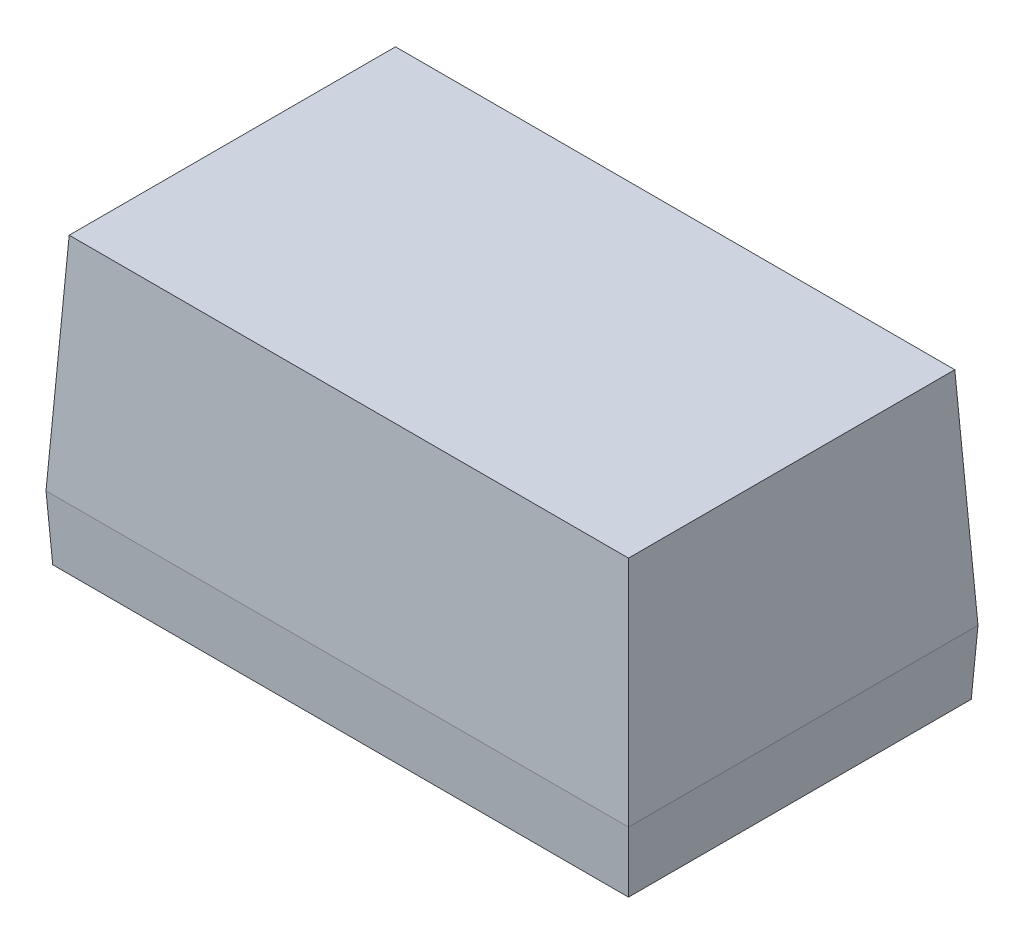
ISO-10303-21;
HEADER;
FILE_DESCRIPTION(('STEP AP214'),'2;1');
FILE_NAME('part.step','',(''),(''),'','','');
FILE_SCHEMA(('AUTOMOTIVE_DESIGN { 1 0 10303 214 1 1 1 1 }'));
ENDSEC;
DATA;
#1=APPLICATION_CONTEXT('core data for automotive mechanical design processes');
#2=APPLICATION_PROTOCOL_DEFINITION('international standard','automotive_design',2000,#1);
#3=PRODUCT_CONTEXT('',#1,'mechanical');
#4=PRODUCT('Part','Part','',(#3));
#5=PRODUCT_RELATED_PRODUCT_CATEGORY('part','',(#4));
#6=PRODUCT_DEFINITION_FORMATION('','',#4);
#7=PRODUCT_DEFINITION_CONTEXT('part definition',#1,'design');
#8=PRODUCT_DEFINITION('design','',#6,#7);
#9=PRODUCT_DEFINITION_SHAPE('','',#8);
#10=(LENGTH_UNIT() NAMED_UNIT(*) SI_UNIT(.MILLI.,.METRE.));
#11=(NAMED_UNIT(*) PLANE_ANGLE_UNIT() SI_UNIT($,.RADIAN.));
#12=(NAMED_UNIT(*) SI_UNIT($,.STERADIAN.) SOLID_ANGLE_UNIT());
#13=UNCERTAINTY_MEASURE_WITH_UNIT(LENGTH_MEASURE(1.E-05),#10,'distance_accuracy_value','');
#14=(GEOMETRIC_REPRESENTATION_CONTEXT(3) GLOBAL_UNCERTAINTY_ASSIGNED_CONTEXT((#13)) GLOBAL_UNIT_ASSIGNED_CONTEXT((#10,
#11,#12)) REPRESENTATION_CONTEXT('',''));
#15=CARTESIAN_POINT('',(0.,0.,0.));
#16=DIRECTION('',(0.,0.,1.));
#17=DIRECTION('',(1.,0.,0.));
#18=AXIS2_PLACEMENT_3D('',#15,#16,#17);
#19=CARTESIAN_POINT('',(4.0212,2.9756,2.8242));
#20=DIRECTION('',(0.,1.,0.));
#21=DIRECTION('',(0.,0.,1.));
#22=AXIS2_PLACEMENT_3D('',#19,#20,#21);
#23=PLANE('',#22);
#24=DIRECTION('',(1.,0.,0.));
#25=VECTOR('',#24,1.);
#26=CARTESIAN_POINT('',(4.0212,2.9756,3.4184351442789));
#27=LINE('',#26,#25);
#28=CARTESIAN_POINT('',(4.0269648557211,2.9756,3.4184351442789));
#29=VERTEX_POINT('',#28);
#30=CARTESIAN_POINT('',(5.0154351442789,2.9756,3.4184351442789));
#31=VERTEX_POINT('',#30);
#32=EDGE_CURVE('E11',#29,#31,#27,.T.);
#33=ORIENTED_EDGE('',*,*,#32,.F.);
#34=DIRECTION('',(0.,0.,1.));
#35=VECTOR('',#34,1.);
#36=CARTESIAN_POINT('',(4.0269648557211,2.9756,2.8242));
#37=LINE('',#36,#35);
#38=CARTESIAN_POINT('',(4.0269648557211,2.9756,2.8299648557211));
#39=VERTEX_POINT('',#38);
#40=EDGE_CURVE('E24',#39,#29,#37,.T.);
#41=ORIENTED_EDGE('',*,*,#40,.F.);
#42=DIRECTION('',(-1.,0.,0.));
#43=VECTOR('',#42,1.);
#44=CARTESIAN_POINT('',(4.0212,2.9756,2.8299648557211));
#45=LINE('',#44,#43);
#46=CARTESIAN_POINT('',(5.0154351442789,2.9756,2.8299648557211));
#47=VERTEX_POINT('',#46);
#48=EDGE_CURVE('E122',#47,#39,#45,.T.);
#49=ORIENTED_EDGE('',*,*,#48,.F.);
#50=DIRECTION('',(0.,0.,-1.));
#51=VECTOR('',#50,1.);
#52=CARTESIAN_POINT('',(5.0154351442789,2.9756,2.8242));
#53=LINE('',#52,#51);
#54=EDGE_CURVE('E119',#31,#47,#53,.T.);
#55=ORIENTED_EDGE('',*,*,#54,.F.);
#56=EDGE_LOOP('',(#33,#41,#49,#55));
#57=FACE_BOUND('',#56,.T.);
#58=ADVANCED_FACE('F17',(#57),#23,.F.);
#59=CARTESIAN_POINT('',(5.0212,3.0856,2.8242));
#60=DIRECTION('',(0.998629534754574,-0.0523359562429439,0.));
#61=DIRECTION('',(0.0523359562429439,0.998629534754574,0.));
#62=AXIS2_PLACEMENT_3D('',#59,#60,#61);
#63=PLANE('',#62);
#64=DIRECTION('',(0.,0.,1.));
#65=VECTOR('',#64,1.);
#66=CARTESIAN_POINT('',(5.0212,3.0856,2.8242));
#67=LINE('',#66,#65);
#68=CARTESIAN_POINT('',(5.0212,3.0856,2.8242));
#69=VERTEX_POINT('',#68);
#70=CARTESIAN_POINT('',(5.0212,3.0856,3.4242));
#71=VERTEX_POINT('',#70);
#72=EDGE_CURVE('E117',#69,#71,#67,.T.);
#73=ORIENTED_EDGE('',*,*,#72,.T.);
#74=DIRECTION('',(-0.0522644276887144,-0.997264688634237,-0.0522644276887144));
#75=VECTOR('',#74,1.);
#76=CARTESIAN_POINT('',(5.0212,3.0856,3.4242));
#77=LINE('',#76,#75);
#78=EDGE_CURVE('E114',#71,#31,#77,.T.);
#79=ORIENTED_EDGE('',*,*,#78,.T.);
#80=ORIENTED_EDGE('',*,*,#54,.T.);
#81=DIRECTION('',(0.0522644276887144,0.997264688634237,-0.0522644276887139));
#82=VECTOR('',#81,1.);
#83=CARTESIAN_POINT('',(5.0154351442789,2.9756,2.8299648557211));
#84=LINE('',#83,#82);
#85=EDGE_CURVE('E111',#47,#69,#84,.T.);
#86=ORIENTED_EDGE('',*,*,#85,.T.);
#87=EDGE_LOOP('',(#73,#79,#80,#86));
#88=FACE_BOUND('',#87,.T.);
#89=ADVANCED_FACE('F137',(#88),#63,.T.);
#90=CARTESIAN_POINT('',(5.0212,3.0856,3.4242));
#91=DIRECTION('',(0.,-0.052335956242944,0.998629534754574));
#92=DIRECTION('',(0.,-0.998629534754574,-0.052335956242944));
#93=AXIS2_PLACEMENT_3D('',#90,#91,#92);
#94=PLANE('',#93);
#95=DIRECTION('',(-1.,0.,0.));
#96=VECTOR('',#95,1.);
#97=CARTESIAN_POINT('',(5.0212,3.0856,3.4242));
#98=LINE('',#97,#96);
#99=CARTESIAN_POINT('',(4.0212,3.0856,3.4242));
#100=VERTEX_POINT('',#99);
#101=EDGE_CURVE('E109',#71,#100,#98,.T.);
#102=ORIENTED_EDGE('',*,*,#101,.T.);
#103=DIRECTION('',(0.0522644276887154,-0.997264688634237,-0.0522644276887139));
#104=VECTOR('',#103,1.);
#105=CARTESIAN_POINT('',(4.0212,3.0856,3.4242));
#106=LINE('',#105,#104);
#107=EDGE_CURVE('E107',#100,#29,#106,.T.);
#108=ORIENTED_EDGE('',*,*,#107,.T.);
#109=ORIENTED_EDGE('',*,*,#32,.T.);
#110=ORIENTED_EDGE('',*,*,#78,.F.);
#111=EDGE_LOOP('',(#102,#108,#109,#110));
#112=FACE_BOUND('',#111,.T.);
#113=ADVANCED_FACE('F128',(#112),#94,.T.);
#114=CARTESIAN_POINT('',(4.0212,3.0856,2.8242));
#115=DIRECTION('',(-0.998629534754574,-0.0523359562429439,0.));
#116=DIRECTION('',(0.0523359562429439,-0.998629534754574,0.));
#117=AXIS2_PLACEMENT_3D('',#114,#115,#116);
#118=PLANE('',#117);
#119=DIRECTION('',(0.,0.,-1.));
#120=VECTOR('',#119,1.);
#121=CARTESIAN_POINT('',(4.0212,3.0856,2.8242));
#122=LINE('',#121,#120);
#123=CARTESIAN_POINT('',(4.0212,3.0856,2.8242));
#124=VERTEX_POINT('',#123);
#125=EDGE_CURVE('E105',#100,#124,#122,.T.);
#126=ORIENTED_EDGE('',*,*,#125,.T.);
#127=DIRECTION('',(0.0522644276887144,-0.997264688634237,0.0522644276887139));
#128=VECTOR('',#127,1.);
#129=CARTESIAN_POINT('',(4.0212,3.0856,2.8242));
#130=LINE('',#129,#128);
#131=EDGE_CURVE('E102',#124,#39,#130,.T.);
#132=ORIENTED_EDGE('',*,*,#131,.T.);
#133=ORIENTED_EDGE('',*,*,#40,.T.);
#134=ORIENTED_EDGE('',*,*,#107,.F.);
#135=EDGE_LOOP('',(#126,#132,#133,#134));
#136=FACE_BOUND('',#135,.T.);
#137=ADVANCED_FACE('F126',(#136),#118,.T.);
#138=CARTESIAN_POINT('',(5.0212,3.0856,2.8242));
#139=DIRECTION('',(0.,-0.0523359562429439,-0.998629534754574));
#140=DIRECTION('',(0.,0.998629534754574,-0.0523359562429439));
#141=AXIS2_PLACEMENT_3D('',#138,#139,#140);
#142=PLANE('',#141);
#143=DIRECTION('',(1.,0.,0.));
#144=VECTOR('',#143,1.);
#145=CARTESIAN_POINT('',(5.0212,3.0856,2.8242));
#146=LINE('',#145,#144);
#147=EDGE_CURVE('E85',#124,#69,#146,.T.);
#148=ORIENTED_EDGE('',*,*,#147,.T.);
#149=ORIENTED_EDGE('',*,*,#85,.F.);
#150=ORIENTED_EDGE('',*,*,#48,.T.);
#151=ORIENTED_EDGE('',*,*,#131,.F.);
#152=EDGE_LOOP('',(#148,#149,#150,#151));
#153=FACE_BOUND('',#152,.T.);
#154=ADVANCED_FACE('F139',(#153),#142,.T.);
#155=CARTESIAN_POINT('',(5.0212,3.0856,2.8242));
#156=DIRECTION('',(0.998629534754574,0.0523359562429439,0.));
#157=DIRECTION('',(-0.0523359562429439,0.998629534754574,0.));
#158=AXIS2_PLACEMENT_3D('',#155,#156,#157);
#159=PLANE('',#158);
#160=ORIENTED_EDGE('',*,*,#72,.F.);
#161=DIRECTION('',(-0.052264427688714,0.997264688634237,0.052264427688714));
#162=VECTOR('',#161,1.);
#163=CARTESIAN_POINT('',(5.0212,3.0856,2.8242));
#164=LINE('',#163,#162);
#165=CARTESIAN_POINT('',(5.0012850438724,3.4656,2.8441149561276));
#166=VERTEX_POINT('',#165);
#167=EDGE_CURVE('E99',#69,#166,#164,.T.);
#168=ORIENTED_EDGE('',*,*,#167,.T.);
#169=DIRECTION('',(0.,0.,1.));
#170=VECTOR('',#169,1.);
#171=CARTESIAN_POINT('',(5.0012850438724,3.4656,2.8242));
#172=LINE('',#171,#170);
#173=CARTESIAN_POINT('',(5.0012850438724,3.4656,3.4042850438724));
#174=VERTEX_POINT('',#173);
#175=EDGE_CURVE('E89',#166,#174,#172,.T.);
#176=ORIENTED_EDGE('',*,*,#175,.T.);
#177=DIRECTION('',(0.052264427688714,-0.997264688634237,0.052264427688714));
#178=VECTOR('',#177,1.);
#179=CARTESIAN_POINT('',(5.0012850438724,3.4656,3.4042850438724));
#180=LINE('',#179,#178);
#181=EDGE_CURVE('E95',#174,#71,#180,.T.);
#182=ORIENTED_EDGE('',*,*,#181,.T.);
#183=EDGE_LOOP('',(#160,#168,#176,#182));
#184=FACE_BOUND('',#183,.T.);
#185=ADVANCED_FACE('F134',(#184),#159,.T.);
#186=CARTESIAN_POINT('',(5.0212,3.0856,3.4242));
#187=DIRECTION('',(0.,0.0523359562429439,0.998629534754574));
#188=DIRECTION('',(0.,-0.998629534754574,0.0523359562429439));
#189=AXIS2_PLACEMENT_3D('',#186,#187,#188);
#190=PLANE('',#189);
#191=DIRECTION('',(-1.,0.,0.));
#192=VECTOR('',#191,1.);
#193=CARTESIAN_POINT('',(5.0212,3.4656,3.4042850438724));
#194=LINE('',#193,#192);
#195=CARTESIAN_POINT('',(4.0411149561276,3.4656,3.4042850438724));
#196=VERTEX_POINT('',#195);
#197=EDGE_CURVE('E93',#174,#196,#194,.T.);
#198=ORIENTED_EDGE('',*,*,#197,.T.);
#199=DIRECTION('',(-0.0522644276887138,-0.997264688634237,0.052264427688714));
#200=VECTOR('',#199,1.);
#201=CARTESIAN_POINT('',(4.0411149561276,3.4656,3.4042850438724));
#202=LINE('',#201,#200);
#203=EDGE_CURVE('E73',#196,#100,#202,.T.);
#204=ORIENTED_EDGE('',*,*,#203,.T.);
#205=ORIENTED_EDGE('',*,*,#101,.F.);
#206=ORIENTED_EDGE('',*,*,#181,.F.);
#207=EDGE_LOOP('',(#198,#204,#205,#206));
#208=FACE_BOUND('',#207,.T.);
#209=ADVANCED_FACE('F132',(#208),#190,.T.);
#210=CARTESIAN_POINT('',(4.0212,3.0856,2.8242));
#211=DIRECTION('',(-0.998629534754574,0.0523359562429439,0.));
#212=DIRECTION('',(-0.0523359562429439,-0.998629534754574,0.));
#213=AXIS2_PLACEMENT_3D('',#210,#211,#212);
#214=PLANE('',#213);
#215=ORIENTED_EDGE('',*,*,#125,.F.);
#216=ORIENTED_EDGE('',*,*,#203,.F.);
#217=DIRECTION('',(0.,0.,-1.));
#218=VECTOR('',#217,1.);
#219=CARTESIAN_POINT('',(4.0411149561276,3.4656,2.8242));
#220=LINE('',#219,#218);
#221=CARTESIAN_POINT('',(4.0411149561276,3.4656,2.8441149561276));
#222=VERTEX_POINT('',#221);
#223=EDGE_CURVE('E67',#196,#222,#220,.T.);
#224=ORIENTED_EDGE('',*,*,#223,.T.);
#225=DIRECTION('',(-0.052264427688714,-0.997264688634237,-0.052264427688714));
#226=VECTOR('',#225,1.);
#227=CARTESIAN_POINT('',(4.0411149561276,3.4656,2.8441149561276));
#228=LINE('',#227,#226);
#229=EDGE_CURVE('E71',#222,#124,#228,.T.);
#230=ORIENTED_EDGE('',*,*,#229,.T.);
#231=EDGE_LOOP('',(#215,#216,#224,#230));
#232=FACE_BOUND('',#231,.T.);
#233=ADVANCED_FACE('F70',(#232),#214,.T.);
#234=CARTESIAN_POINT('',(5.0212,3.0856,2.8242));
#235=DIRECTION('',(0.,0.052335956242944,-0.998629534754574));
#236=DIRECTION('',(0.,0.998629534754574,0.052335956242944));
#237=AXIS2_PLACEMENT_3D('',#234,#235,#236);
#238=PLANE('',#237);
#239=ORIENTED_EDGE('',*,*,#167,.F.);
#240=ORIENTED_EDGE('',*,*,#147,.F.);
#241=ORIENTED_EDGE('',*,*,#229,.F.);
#242=DIRECTION('',(1.,0.,0.));
#243=VECTOR('',#242,1.);
#244=CARTESIAN_POINT('',(5.0212,3.4656,2.8441149561276));
#245=LINE('',#244,#243);
#246=EDGE_CURVE('E83',#222,#166,#245,.T.);
#247=ORIENTED_EDGE('',*,*,#246,.T.);
#248=EDGE_LOOP('',(#239,#240,#241,#247));
#249=FACE_BOUND('',#248,.T.);
#250=ADVANCED_FACE('F82',(#249),#238,.T.);
#251=CARTESIAN_POINT('',(4.0212,3.4656,2.8242));
#252=DIRECTION('',(0.,1.,0.));
#253=DIRECTION('',(0.,0.,1.));
#254=AXIS2_PLACEMENT_3D('',#251,#252,#253);
#255=PLANE('',#254);
#256=ORIENTED_EDGE('',*,*,#175,.F.);
#257=ORIENTED_EDGE('',*,*,#246,.F.);
#258=ORIENTED_EDGE('',*,*,#223,.F.);
#259=ORIENTED_EDGE('',*,*,#197,.F.);
#260=EDGE_LOOP('',(#256,#257,#258,#259));
#261=FACE_BOUND('',#260,.T.);
#262=ADVANCED_FACE('F88',(#261),#255,.T.);
#263=CLOSED_SHELL('',(#58,#89,#113,#137,#154,#185,#209,#233,#250,#262));
#264=MANIFOLD_SOLID_BREP('B1',#263);
#265=ADVANCED_BREP_SHAPE_REPRESENTATION('',(#18,#264),#14);
#266=SHAPE_DEFINITION_REPRESENTATION(#9,#265);
ENDSEC;
END-ISO-10303-21;
